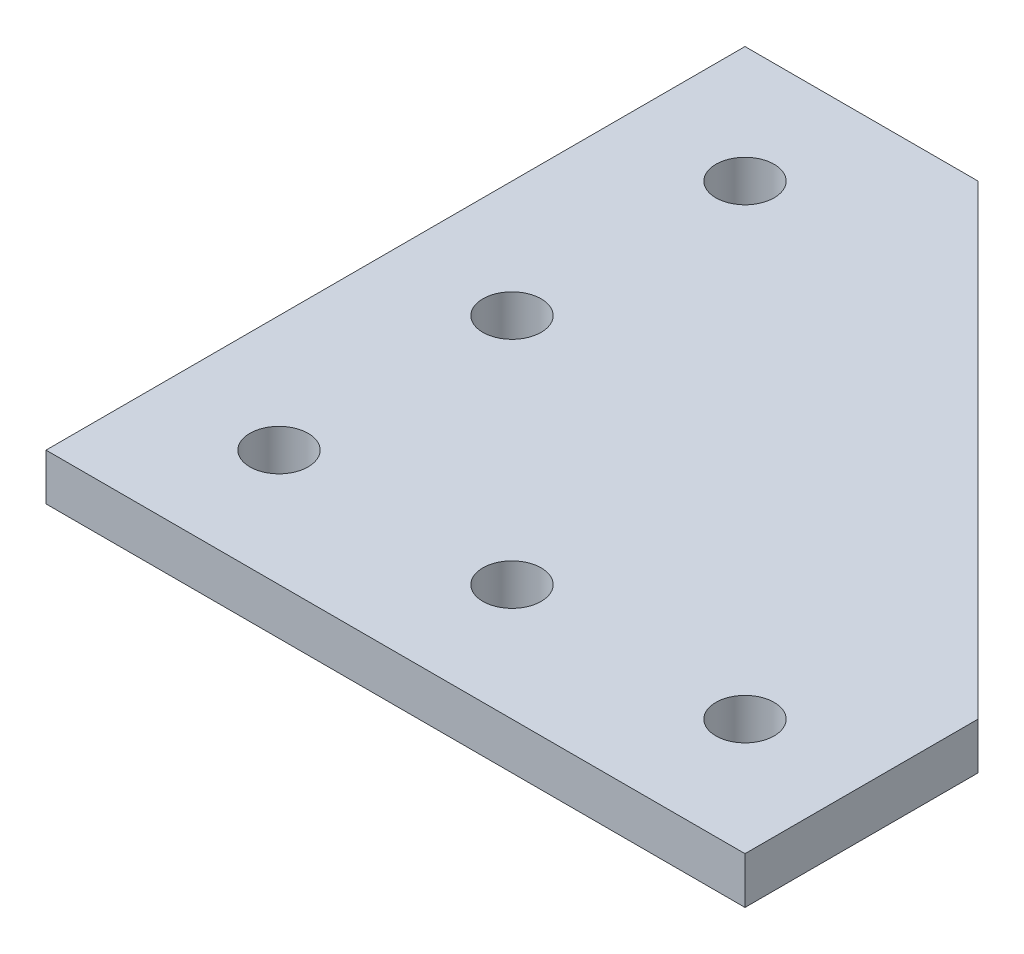
ISO-10303-21;
HEADER;
FILE_DESCRIPTION(('STEP AP214'),'2;1');
FILE_NAME('part.step','',(''),(''),'','','');
FILE_SCHEMA(('AUTOMOTIVE_DESIGN { 1 0 10303 214 1 1 1 1 }'));
ENDSEC;
DATA;
#1=APPLICATION_CONTEXT('core data for automotive mechanical design processes');
#2=APPLICATION_PROTOCOL_DEFINITION('international standard','automotive_design',2000,#1);
#3=PRODUCT_CONTEXT('',#1,'mechanical');
#4=PRODUCT('Part','Part','',(#3));
#5=PRODUCT_RELATED_PRODUCT_CATEGORY('part','',(#4));
#6=PRODUCT_DEFINITION_FORMATION('','',#4);
#7=PRODUCT_DEFINITION_CONTEXT('part definition',#1,'design');
#8=PRODUCT_DEFINITION('design','',#6,#7);
#9=PRODUCT_DEFINITION_SHAPE('','',#8);
#10=(LENGTH_UNIT() NAMED_UNIT(*) SI_UNIT(.MILLI.,.METRE.));
#11=(NAMED_UNIT(*) PLANE_ANGLE_UNIT() SI_UNIT($,.RADIAN.));
#12=(NAMED_UNIT(*) SI_UNIT($,.STERADIAN.) SOLID_ANGLE_UNIT());
#13=UNCERTAINTY_MEASURE_WITH_UNIT(LENGTH_MEASURE(1.E-05),#10,'distance_accuracy_value','');
#14=(GEOMETRIC_REPRESENTATION_CONTEXT(3) GLOBAL_UNCERTAINTY_ASSIGNED_CONTEXT((#13)) GLOBAL_UNIT_ASSIGNED_CONTEXT((#10,
#11,#12)) REPRESENTATION_CONTEXT('',''));
#15=CARTESIAN_POINT('',(0.,0.,0.));
#16=DIRECTION('',(0.,0.,1.));
#17=DIRECTION('',(1.,0.,0.));
#18=AXIS2_PLACEMENT_3D('',#15,#16,#17);
#19=CARTESIAN_POINT('',(-10.,2.,10.));
#20=DIRECTION('',(0.,0.,-1.));
#21=DIRECTION('',(-1.,0.,0.));
#22=AXIS2_PLACEMENT_3D('',#19,#20,#21);
#23=PLANE('',#22);
#24=DIRECTION('',(1.,0.,0.));
#25=VECTOR('',#24,1.);
#26=CARTESIAN_POINT('',(-10.,-2.,10.));
#27=LINE('',#26,#25);
#28=CARTESIAN_POINT('',(-10.,-2.,10.));
#29=VERTEX_POINT('',#28);
#30=CARTESIAN_POINT('',(50.,-2.,10.));
#31=VERTEX_POINT('',#30);
#32=EDGE_CURVE('E107',#29,#31,#27,.T.);
#33=ORIENTED_EDGE('',*,*,#32,.T.);
#34=DIRECTION('',(0.,-1.,0.));
#35=VECTOR('',#34,1.);
#36=CARTESIAN_POINT('',(50.,2.,10.));
#37=LINE('',#36,#35);
#38=CARTESIAN_POINT('',(50.,2.,10.));
#39=VERTEX_POINT('',#38);
#40=EDGE_CURVE('E11',#39,#31,#37,.T.);
#41=ORIENTED_EDGE('',*,*,#40,.F.);
#42=DIRECTION('',(1.,0.,0.));
#43=VECTOR('',#42,1.);
#44=CARTESIAN_POINT('',(-10.,2.,10.));
#45=LINE('',#44,#43);
#46=CARTESIAN_POINT('',(-10.,2.,10.));
#47=VERTEX_POINT('',#46);
#48=EDGE_CURVE('E116',#47,#39,#45,.T.);
#49=ORIENTED_EDGE('',*,*,#48,.F.);
#50=DIRECTION('',(0.,-1.,0.));
#51=VECTOR('',#50,1.);
#52=CARTESIAN_POINT('',(-10.,2.,10.));
#53=LINE('',#52,#51);
#54=EDGE_CURVE('E103',#47,#29,#53,.T.);
#55=ORIENTED_EDGE('',*,*,#54,.T.);
#56=EDGE_LOOP('',(#33,#41,#49,#55));
#57=FACE_BOUND('',#56,.T.);
#58=ADVANCED_FACE('F33',(#57),#23,.F.);
#59=CARTESIAN_POINT('',(50.,2.,10.));
#60=DIRECTION('',(-1.,0.,0.));
#61=DIRECTION('',(0.,0.,1.));
#62=AXIS2_PLACEMENT_3D('',#59,#60,#61);
#63=PLANE('',#62);
#64=DIRECTION('',(0.,0.,-1.));
#65=VECTOR('',#64,1.);
#66=CARTESIAN_POINT('',(50.,-2.,10.));
#67=LINE('',#66,#65);
#68=CARTESIAN_POINT('',(50.,-2.,-10.));
#69=VERTEX_POINT('',#68);
#70=EDGE_CURVE('E110',#31,#69,#67,.T.);
#71=ORIENTED_EDGE('',*,*,#70,.T.);
#72=DIRECTION('',(0.,-1.,0.));
#73=VECTOR('',#72,1.);
#74=CARTESIAN_POINT('',(50.,2.,-10.));
#75=LINE('',#74,#73);
#76=CARTESIAN_POINT('',(50.,2.,-10.));
#77=VERTEX_POINT('',#76);
#78=EDGE_CURVE('E41',#77,#69,#75,.T.);
#79=ORIENTED_EDGE('',*,*,#78,.F.);
#80=DIRECTION('',(0.,0.,-1.));
#81=VECTOR('',#80,1.);
#82=CARTESIAN_POINT('',(50.,2.,10.));
#83=LINE('',#82,#81);
#84=EDGE_CURVE('E83',#39,#77,#83,.T.);
#85=ORIENTED_EDGE('',*,*,#84,.F.);
#86=ORIENTED_EDGE('',*,*,#40,.T.);
#87=EDGE_LOOP('',(#71,#79,#85,#86));
#88=FACE_BOUND('',#87,.T.);
#89=ADVANCED_FACE('F136',(#88),#63,.F.);
#90=CARTESIAN_POINT('',(50.,2.,-10.));
#91=DIRECTION('',(-0.707106781186547,0.,0.707106781186547));
#92=DIRECTION('',(0.707106781186548,0.,0.707106781186548));
#93=AXIS2_PLACEMENT_3D('',#90,#91,#92);
#94=PLANE('',#93);
#95=DIRECTION('',(-0.707106781186548,0.,-0.707106781186548));
#96=VECTOR('',#95,1.);
#97=CARTESIAN_POINT('',(50.,-2.,-10.));
#98=LINE('',#97,#96);
#99=CARTESIAN_POINT('',(10.,-2.,-50.));
#100=VERTEX_POINT('',#99);
#101=EDGE_CURVE('E98',#69,#100,#98,.T.);
#102=ORIENTED_EDGE('',*,*,#101,.T.);
#103=DIRECTION('',(0.,-1.,0.));
#104=VECTOR('',#103,1.);
#105=CARTESIAN_POINT('',(10.,2.,-50.));
#106=LINE('',#105,#104);
#107=CARTESIAN_POINT('',(10.,2.,-50.));
#108=VERTEX_POINT('',#107);
#109=EDGE_CURVE('E95',#108,#100,#106,.T.);
#110=ORIENTED_EDGE('',*,*,#109,.F.);
#111=DIRECTION('',(-0.707106781186548,0.,-0.707106781186548));
#112=VECTOR('',#111,1.);
#113=CARTESIAN_POINT('',(50.,2.,-10.));
#114=LINE('',#113,#112);
#115=EDGE_CURVE('E87',#77,#108,#114,.T.);
#116=ORIENTED_EDGE('',*,*,#115,.F.);
#117=ORIENTED_EDGE('',*,*,#78,.T.);
#118=EDGE_LOOP('',(#102,#110,#116,#117));
#119=FACE_BOUND('',#118,.T.);
#120=ADVANCED_FACE('F96',(#119),#94,.F.);
#121=CARTESIAN_POINT('',(-10.,2.,-50.));
#122=DIRECTION('',(0.,0.,1.));
#123=DIRECTION('',(1.,0.,0.));
#124=AXIS2_PLACEMENT_3D('',#121,#122,#123);
#125=PLANE('',#124);
#126=DIRECTION('',(-1.,0.,0.));
#127=VECTOR('',#126,1.);
#128=CARTESIAN_POINT('',(-10.,-2.,-50.));
#129=LINE('',#128,#127);
#130=CARTESIAN_POINT('',(-10.,-2.,-50.));
#131=VERTEX_POINT('',#130);
#132=EDGE_CURVE('E69',#100,#131,#129,.T.);
#133=ORIENTED_EDGE('',*,*,#132,.T.);
#134=DIRECTION('',(0.,-1.,0.));
#135=VECTOR('',#134,1.);
#136=CARTESIAN_POINT('',(-10.,2.,-50.));
#137=LINE('',#136,#135);
#138=CARTESIAN_POINT('',(-10.,2.,-50.));
#139=VERTEX_POINT('',#138);
#140=EDGE_CURVE('E99',#139,#131,#137,.T.);
#141=ORIENTED_EDGE('',*,*,#140,.F.);
#142=DIRECTION('',(-1.,0.,0.));
#143=VECTOR('',#142,1.);
#144=CARTESIAN_POINT('',(-10.,2.,-50.));
#145=LINE('',#144,#143);
#146=EDGE_CURVE('E91',#108,#139,#145,.T.);
#147=ORIENTED_EDGE('',*,*,#146,.F.);
#148=ORIENTED_EDGE('',*,*,#109,.T.);
#149=EDGE_LOOP('',(#133,#141,#147,#148));
#150=FACE_BOUND('',#149,.T.);
#151=ADVANCED_FACE('F101',(#150),#125,.F.);
#152=CARTESIAN_POINT('',(-10.,2.,10.));
#153=DIRECTION('',(1.,0.,0.));
#154=DIRECTION('',(0.,0.,-1.));
#155=AXIS2_PLACEMENT_3D('',#152,#153,#154);
#156=PLANE('',#155);
#157=DIRECTION('',(0.,0.,1.));
#158=VECTOR('',#157,1.);
#159=CARTESIAN_POINT('',(-10.,-2.,10.));
#160=LINE('',#159,#158);
#161=EDGE_CURVE('E75',#131,#29,#160,.T.);
#162=ORIENTED_EDGE('',*,*,#161,.T.);
#163=ORIENTED_EDGE('',*,*,#54,.F.);
#164=DIRECTION('',(0.,0.,1.));
#165=VECTOR('',#164,1.);
#166=CARTESIAN_POINT('',(-10.,2.,10.));
#167=LINE('',#166,#165);
#168=EDGE_CURVE('E49',#139,#47,#167,.T.);
#169=ORIENTED_EDGE('',*,*,#168,.F.);
#170=ORIENTED_EDGE('',*,*,#140,.T.);
#171=EDGE_LOOP('',(#162,#163,#169,#170));
#172=FACE_BOUND('',#171,.T.);
#173=ADVANCED_FACE('F124',(#172),#156,.F.);
#174=CARTESIAN_POINT('',(0.,2.,0.));
#175=DIRECTION('',(0.,1.,0.));
#176=DIRECTION('',(0.,0.,1.));
#177=AXIS2_PLACEMENT_3D('',#174,#175,#176);
#178=PLANE('',#177);
#179=CARTESIAN_POINT('',(-1.37209959955431E-13,2.,-40.));
#180=DIRECTION('',(0.,1.,0.));
#181=DIRECTION('',(0.,0.,1.));
#182=AXIS2_PLACEMENT_3D('',#179,#180,#181);
#183=CIRCLE('',#182,2.5);
#184=CARTESIAN_POINT('',(-1.37209959955431E-13,2.,-37.5));
#185=VERTEX_POINT('',#184);
#186=EDGE_CURVE('E228',#185,#185,#183,.T.);
#187=ORIENTED_EDGE('',*,*,#186,.F.);
#188=EDGE_LOOP('',(#187));
#189=FACE_BOUND('',#188,.T.);
#190=CARTESIAN_POINT('',(0.,2.,-20.));
#191=DIRECTION('',(0.,1.,0.));
#192=DIRECTION('',(0.,0.,1.));
#193=AXIS2_PLACEMENT_3D('',#190,#191,#192);
#194=CIRCLE('',#193,2.5);
#195=CARTESIAN_POINT('',(0.,2.,-17.5));
#196=VERTEX_POINT('',#195);
#197=EDGE_CURVE('E230',#196,#196,#194,.T.);
#198=ORIENTED_EDGE('',*,*,#197,.F.);
#199=EDGE_LOOP('',(#198));
#200=FACE_BOUND('',#199,.T.);
#201=CARTESIAN_POINT('',(40.,2.,0.));
#202=DIRECTION('',(0.,1.,0.));
#203=DIRECTION('',(0.,0.,1.));
#204=AXIS2_PLACEMENT_3D('',#201,#202,#203);
#205=CIRCLE('',#204,2.5);
#206=CARTESIAN_POINT('',(40.,2.,2.5));
#207=VERTEX_POINT('',#206);
#208=EDGE_CURVE('E256',#207,#207,#205,.T.);
#209=ORIENTED_EDGE('',*,*,#208,.F.);
#210=EDGE_LOOP('',(#209));
#211=FACE_BOUND('',#210,.T.);
#212=CARTESIAN_POINT('',(20.,2.,0.));
#213=DIRECTION('',(0.,1.,0.));
#214=DIRECTION('',(0.,0.,1.));
#215=AXIS2_PLACEMENT_3D('',#212,#213,#214);
#216=CIRCLE('',#215,2.5);
#217=CARTESIAN_POINT('',(20.,2.,2.5));
#218=VERTEX_POINT('',#217);
#219=EDGE_CURVE('E248',#218,#218,#216,.T.);
#220=ORIENTED_EDGE('',*,*,#219,.F.);
#221=EDGE_LOOP('',(#220));
#222=FACE_BOUND('',#221,.T.);
#223=CARTESIAN_POINT('',(0.,2.,0.));
#224=DIRECTION('',(0.,1.,0.));
#225=DIRECTION('',(0.,0.,1.));
#226=AXIS2_PLACEMENT_3D('',#223,#224,#225);
#227=CIRCLE('',#226,2.5);
#228=CARTESIAN_POINT('',(0.,2.,2.5));
#229=VERTEX_POINT('',#228);
#230=EDGE_CURVE('E236',#229,#229,#227,.T.);
#231=ORIENTED_EDGE('',*,*,#230,.F.);
#232=EDGE_LOOP('',(#231));
#233=FACE_BOUND('',#232,.T.);
#234=ORIENTED_EDGE('',*,*,#48,.T.);
#235=ORIENTED_EDGE('',*,*,#84,.T.);
#236=ORIENTED_EDGE('',*,*,#115,.T.);
#237=ORIENTED_EDGE('',*,*,#146,.T.);
#238=ORIENTED_EDGE('',*,*,#168,.T.);
#239=EDGE_LOOP('',(#234,#235,#236,#237,#238));
#240=FACE_BOUND('',#239,.T.);
#241=ADVANCED_FACE('F89',(#189,#200,#211,#222,#233,#240),#178,.T.);
#242=CARTESIAN_POINT('',(0.,-2.,0.));
#243=DIRECTION('',(0.,1.,0.));
#244=DIRECTION('',(0.,0.,1.));
#245=AXIS2_PLACEMENT_3D('',#242,#243,#244);
#246=PLANE('',#245);
#247=CARTESIAN_POINT('',(-1.37209959955431E-13,-2.,-40.));
#248=DIRECTION('',(0.,1.,0.));
#249=DIRECTION('',(0.,0.,1.));
#250=AXIS2_PLACEMENT_3D('',#247,#248,#249);
#251=CIRCLE('',#250,2.5);
#252=CARTESIAN_POINT('',(-1.37209959955431E-13,-2.,-37.5));
#253=VERTEX_POINT('',#252);
#254=EDGE_CURVE('E225',#253,#253,#251,.T.);
#255=ORIENTED_EDGE('',*,*,#254,.T.);
#256=EDGE_LOOP('',(#255));
#257=FACE_BOUND('',#256,.T.);
#258=CARTESIAN_POINT('',(0.,-2.,-20.));
#259=DIRECTION('',(0.,1.,0.));
#260=DIRECTION('',(0.,0.,1.));
#261=AXIS2_PLACEMENT_3D('',#258,#259,#260);
#262=CIRCLE('',#261,2.5);
#263=CARTESIAN_POINT('',(0.,-2.,-17.5));
#264=VERTEX_POINT('',#263);
#265=EDGE_CURVE('E233',#264,#264,#262,.T.);
#266=ORIENTED_EDGE('',*,*,#265,.T.);
#267=EDGE_LOOP('',(#266));
#268=FACE_BOUND('',#267,.T.);
#269=CARTESIAN_POINT('',(40.,-2.,0.));
#270=DIRECTION('',(0.,1.,0.));
#271=DIRECTION('',(0.,0.,1.));
#272=AXIS2_PLACEMENT_3D('',#269,#270,#271);
#273=CIRCLE('',#272,2.5);
#274=CARTESIAN_POINT('',(40.,-2.,2.5));
#275=VERTEX_POINT('',#274);
#276=EDGE_CURVE('E253',#275,#275,#273,.T.);
#277=ORIENTED_EDGE('',*,*,#276,.T.);
#278=EDGE_LOOP('',(#277));
#279=FACE_BOUND('',#278,.T.);
#280=CARTESIAN_POINT('',(20.,-2.,0.));
#281=DIRECTION('',(0.,1.,0.));
#282=DIRECTION('',(0.,0.,1.));
#283=AXIS2_PLACEMENT_3D('',#280,#281,#282);
#284=CIRCLE('',#283,2.5);
#285=CARTESIAN_POINT('',(20.,-2.,2.5));
#286=VERTEX_POINT('',#285);
#287=EDGE_CURVE('E239',#286,#286,#284,.T.);
#288=ORIENTED_EDGE('',*,*,#287,.T.);
#289=EDGE_LOOP('',(#288));
#290=FACE_BOUND('',#289,.T.);
#291=CARTESIAN_POINT('',(0.,-2.,0.));
#292=DIRECTION('',(0.,1.,0.));
#293=DIRECTION('',(0.,0.,1.));
#294=AXIS2_PLACEMENT_3D('',#291,#292,#293);
#295=CIRCLE('',#294,2.5);
#296=CARTESIAN_POINT('',(0.,-2.,2.5));
#297=VERTEX_POINT('',#296);
#298=EDGE_CURVE('E111',#297,#297,#295,.T.);
#299=ORIENTED_EDGE('',*,*,#298,.T.);
#300=EDGE_LOOP('',(#299));
#301=FACE_BOUND('',#300,.T.);
#302=ORIENTED_EDGE('',*,*,#32,.F.);
#303=ORIENTED_EDGE('',*,*,#161,.F.);
#304=ORIENTED_EDGE('',*,*,#132,.F.);
#305=ORIENTED_EDGE('',*,*,#101,.F.);
#306=ORIENTED_EDGE('',*,*,#70,.F.);
#307=EDGE_LOOP('',(#302,#303,#304,#305,#306));
#308=FACE_BOUND('',#307,.T.);
#309=ADVANCED_FACE('F120',(#257,#268,#279,#290,#301,#308),#246,.F.);
#310=CARTESIAN_POINT('',(0.,-2.,0.));
#311=DIRECTION('',(0.,1.,0.));
#312=DIRECTION('',(0.,0.,1.));
#313=AXIS2_PLACEMENT_3D('',#310,#311,#312);
#314=CYLINDRICAL_SURFACE('',#313,2.5);
#315=ORIENTED_EDGE('',*,*,#298,.F.);
#316=EDGE_LOOP('',(#315));
#317=FACE_BOUND('',#316,.T.);
#318=ORIENTED_EDGE('',*,*,#230,.T.);
#319=EDGE_LOOP('',(#318));
#320=FACE_BOUND('',#319,.T.);
#321=ADVANCED_FACE('F169',(#317,#320),#314,.F.);
#322=CARTESIAN_POINT('',(20.,-2.,0.));
#323=DIRECTION('',(0.,1.,0.));
#324=DIRECTION('',(0.,0.,1.));
#325=AXIS2_PLACEMENT_3D('',#322,#323,#324);
#326=CYLINDRICAL_SURFACE('',#325,2.5);
#327=ORIENTED_EDGE('',*,*,#287,.F.);
#328=EDGE_LOOP('',(#327));
#329=FACE_BOUND('',#328,.T.);
#330=ORIENTED_EDGE('',*,*,#219,.T.);
#331=EDGE_LOOP('',(#330));
#332=FACE_BOUND('',#331,.T.);
#333=ADVANCED_FACE('F178',(#329,#332),#326,.F.);
#334=CARTESIAN_POINT('',(40.,-2.,0.));
#335=DIRECTION('',(0.,1.,0.));
#336=DIRECTION('',(0.,0.,1.));
#337=AXIS2_PLACEMENT_3D('',#334,#335,#336);
#338=CYLINDRICAL_SURFACE('',#337,2.5);
#339=ORIENTED_EDGE('',*,*,#276,.F.);
#340=EDGE_LOOP('',(#339));
#341=FACE_BOUND('',#340,.T.);
#342=ORIENTED_EDGE('',*,*,#208,.T.);
#343=EDGE_LOOP('',(#342));
#344=FACE_BOUND('',#343,.T.);
#345=ADVANCED_FACE('F188',(#341,#344),#338,.F.);
#346=CARTESIAN_POINT('',(0.,-2.,-20.));
#347=DIRECTION('',(0.,1.,0.));
#348=DIRECTION('',(0.,0.,1.));
#349=AXIS2_PLACEMENT_3D('',#346,#347,#348);
#350=CYLINDRICAL_SURFACE('',#349,2.5);
#351=ORIENTED_EDGE('',*,*,#265,.F.);
#352=EDGE_LOOP('',(#351));
#353=FACE_BOUND('',#352,.T.);
#354=ORIENTED_EDGE('',*,*,#197,.T.);
#355=EDGE_LOOP('',(#354));
#356=FACE_BOUND('',#355,.T.);
#357=ADVANCED_FACE('F198',(#353,#356),#350,.F.);
#358=CARTESIAN_POINT('',(-1.37209959955431E-13,-2.,-40.));
#359=DIRECTION('',(0.,1.,0.));
#360=DIRECTION('',(0.,0.,1.));
#361=AXIS2_PLACEMENT_3D('',#358,#359,#360);
#362=CYLINDRICAL_SURFACE('',#361,2.5);
#363=ORIENTED_EDGE('',*,*,#254,.F.);
#364=EDGE_LOOP('',(#363));
#365=FACE_BOUND('',#364,.T.);
#366=ORIENTED_EDGE('',*,*,#186,.T.);
#367=EDGE_LOOP('',(#366));
#368=FACE_BOUND('',#367,.T.);
#369=ADVANCED_FACE('F208',(#365,#368),#362,.F.);
#370=CLOSED_SHELL('',(#58,#89,#120,#151,#173,#241,#309,#321,#333,#345,#357,#369));
#371=MANIFOLD_SOLID_BREP('B2',#370);
#372=ADVANCED_BREP_SHAPE_REPRESENTATION('',(#18,#371),#14);
#373=SHAPE_DEFINITION_REPRESENTATION(#9,#372);
ENDSEC;
END-ISO-10303-21;
